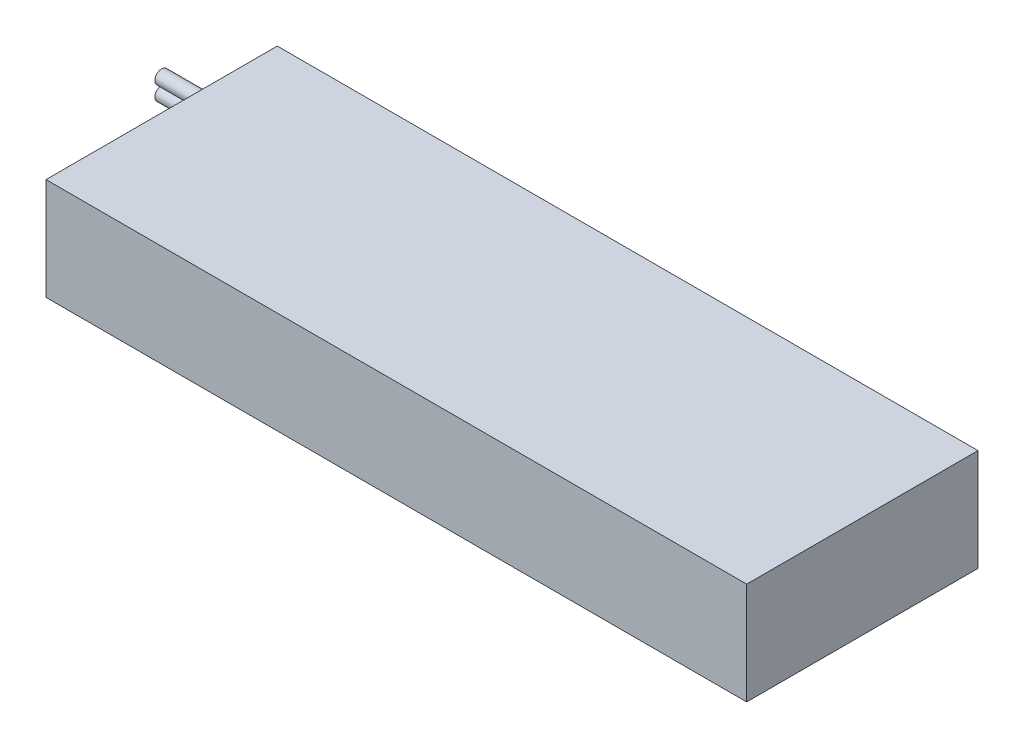
ISO-10303-21;
HEADER;
FILE_DESCRIPTION(('STEP AP214'),'2;1');
FILE_NAME('part.step','',(''),(''),'','','');
FILE_SCHEMA(('AUTOMOTIVE_DESIGN { 1 0 10303 214 1 1 1 1 }'));
ENDSEC;
DATA;
#1=APPLICATION_CONTEXT('core data for automotive mechanical design processes');
#2=APPLICATION_PROTOCOL_DEFINITION('international standard','automotive_design',2000,#1);
#3=PRODUCT_CONTEXT('',#1,'mechanical');
#4=PRODUCT('Part','Part','',(#3));
#5=PRODUCT_RELATED_PRODUCT_CATEGORY('part','',(#4));
#6=PRODUCT_DEFINITION_FORMATION('','',#4);
#7=PRODUCT_DEFINITION_CONTEXT('part definition',#1,'design');
#8=PRODUCT_DEFINITION('design','',#6,#7);
#9=PRODUCT_DEFINITION_SHAPE('','',#8);
#10=(LENGTH_UNIT() NAMED_UNIT(*) SI_UNIT(.MILLI.,.METRE.));
#11=(NAMED_UNIT(*) PLANE_ANGLE_UNIT() SI_UNIT($,.RADIAN.));
#12=(NAMED_UNIT(*) SI_UNIT($,.STERADIAN.) SOLID_ANGLE_UNIT());
#13=UNCERTAINTY_MEASURE_WITH_UNIT(LENGTH_MEASURE(1.E-05),#10,'distance_accuracy_value','');
#14=(GEOMETRIC_REPRESENTATION_CONTEXT(3) GLOBAL_UNCERTAINTY_ASSIGNED_CONTEXT((#13)) GLOBAL_UNIT_ASSIGNED_CONTEXT((#10,
#11,#12)) REPRESENTATION_CONTEXT('',''));
#15=CARTESIAN_POINT('',(0.,0.,0.));
#16=DIRECTION('',(0.,0.,1.));
#17=DIRECTION('',(1.,0.,0.));
#18=AXIS2_PLACEMENT_3D('',#15,#16,#17);
#19=CARTESIAN_POINT('',(0.,0.,34.));
#20=DIRECTION('',(1.,0.,0.));
#21=DIRECTION('',(0.,0.,-1.));
#22=AXIS2_PLACEMENT_3D('',#19,#20,#21);
#23=PLANE('',#22);
#24=CARTESIAN_POINT('',(0.,4.6,2.));
#25=DIRECTION('',(1.,0.,0.));
#26=DIRECTION('',(0.,0.,-1.));
#27=AXIS2_PLACEMENT_3D('',#24,#25,#26);
#28=CIRCLE('',#27,1.);
#29=CARTESIAN_POINT('',(0.,4.6,1.));
#30=VERTEX_POINT('',#29);
#31=EDGE_CURVE('E11',#30,#30,#28,.F.);
#32=ORIENTED_EDGE('',*,*,#31,.F.);
#33=EDGE_LOOP('',(#32));
#34=FACE_BOUND('',#33,.T.);
#35=CARTESIAN_POINT('',(0.,2.5,2.));
#36=DIRECTION('',(1.,0.,0.));
#37=DIRECTION('',(0.,0.,-1.));
#38=AXIS2_PLACEMENT_3D('',#35,#36,#37);
#39=CIRCLE('',#38,1.);
#40=CARTESIAN_POINT('',(0.,2.5,1.));
#41=VERTEX_POINT('',#40);
#42=EDGE_CURVE('E45',#41,#41,#39,.F.);
#43=ORIENTED_EDGE('',*,*,#42,.F.);
#44=EDGE_LOOP('',(#43));
#45=FACE_BOUND('',#44,.T.);
#46=DIRECTION('',(0.,-1.,0.));
#47=VECTOR('',#46,1.);
#48=CARTESIAN_POINT('',(0.,0.,0.));
#49=LINE('',#48,#47);
#50=CARTESIAN_POINT('',(0.,15.,0.));
#51=VERTEX_POINT('',#50);
#52=CARTESIAN_POINT('',(0.,0.,0.));
#53=VERTEX_POINT('',#52);
#54=EDGE_CURVE('E104',#51,#53,#49,.T.);
#55=ORIENTED_EDGE('',*,*,#54,.T.);
#56=DIRECTION('',(0.,0.,-1.));
#57=VECTOR('',#56,1.);
#58=CARTESIAN_POINT('',(0.,0.,34.));
#59=LINE('',#58,#57);
#60=CARTESIAN_POINT('',(0.,0.,34.));
#61=VERTEX_POINT('',#60);
#62=EDGE_CURVE('E95',#61,#53,#59,.T.);
#63=ORIENTED_EDGE('',*,*,#62,.F.);
#64=DIRECTION('',(0.,-1.,0.));
#65=VECTOR('',#64,1.);
#66=CARTESIAN_POINT('',(0.,0.,34.));
#67=LINE('',#66,#65);
#68=CARTESIAN_POINT('',(0.,15.,34.));
#69=VERTEX_POINT('',#68);
#70=EDGE_CURVE('E89',#69,#61,#67,.T.);
#71=ORIENTED_EDGE('',*,*,#70,.F.);
#72=DIRECTION('',(0.,0.,-1.));
#73=VECTOR('',#72,1.);
#74=CARTESIAN_POINT('',(0.,15.,34.));
#75=LINE('',#74,#73);
#76=EDGE_CURVE('E100',#69,#51,#75,.T.);
#77=ORIENTED_EDGE('',*,*,#76,.T.);
#78=EDGE_LOOP('',(#55,#63,#71,#77));
#79=FACE_BOUND('',#78,.T.);
#80=ADVANCED_FACE('F37',(#34,#45,#79),#23,.F.);
#81=CARTESIAN_POINT('',(0.,0.,34.));
#82=DIRECTION('',(0.,1.,0.));
#83=DIRECTION('',(0.,0.,1.));
#84=AXIS2_PLACEMENT_3D('',#81,#82,#83);
#85=PLANE('',#84);
#86=DIRECTION('',(1.,0.,0.));
#87=VECTOR('',#86,1.);
#88=CARTESIAN_POINT('',(0.,0.,0.));
#89=LINE('',#88,#87);
#90=CARTESIAN_POINT('',(103.,0.,0.));
#91=VERTEX_POINT('',#90);
#92=EDGE_CURVE('E94',#53,#91,#89,.T.);
#93=ORIENTED_EDGE('',*,*,#92,.T.);
#94=DIRECTION('',(0.,0.,-1.));
#95=VECTOR('',#94,1.);
#96=CARTESIAN_POINT('',(103.,0.,34.));
#97=LINE('',#96,#95);
#98=CARTESIAN_POINT('',(103.,0.,34.));
#99=VERTEX_POINT('',#98);
#100=EDGE_CURVE('E92',#99,#91,#97,.T.);
#101=ORIENTED_EDGE('',*,*,#100,.F.);
#102=DIRECTION('',(1.,0.,0.));
#103=VECTOR('',#102,1.);
#104=CARTESIAN_POINT('',(0.,0.,34.));
#105=LINE('',#104,#103);
#106=EDGE_CURVE('E84',#61,#99,#105,.T.);
#107=ORIENTED_EDGE('',*,*,#106,.F.);
#108=ORIENTED_EDGE('',*,*,#62,.T.);
#109=EDGE_LOOP('',(#93,#101,#107,#108));
#110=FACE_BOUND('',#109,.T.);
#111=ADVANCED_FACE('F93',(#110),#85,.F.);
#112=CARTESIAN_POINT('',(103.,0.,34.));
#113=DIRECTION('',(-1.,0.,0.));
#114=DIRECTION('',(0.,0.,1.));
#115=AXIS2_PLACEMENT_3D('',#112,#113,#114);
#116=PLANE('',#115);
#117=DIRECTION('',(0.,1.,0.));
#118=VECTOR('',#117,1.);
#119=CARTESIAN_POINT('',(103.,0.,0.));
#120=LINE('',#119,#118);
#121=CARTESIAN_POINT('',(103.,15.,0.));
#122=VERTEX_POINT('',#121);
#123=EDGE_CURVE('E70',#91,#122,#120,.T.);
#124=ORIENTED_EDGE('',*,*,#123,.T.);
#125=DIRECTION('',(0.,0.,-1.));
#126=VECTOR('',#125,1.);
#127=CARTESIAN_POINT('',(103.,15.,34.));
#128=LINE('',#127,#126);
#129=CARTESIAN_POINT('',(103.,15.,34.));
#130=VERTEX_POINT('',#129);
#131=EDGE_CURVE('E96',#130,#122,#128,.T.);
#132=ORIENTED_EDGE('',*,*,#131,.F.);
#133=DIRECTION('',(0.,1.,0.));
#134=VECTOR('',#133,1.);
#135=CARTESIAN_POINT('',(103.,0.,34.));
#136=LINE('',#135,#134);
#137=EDGE_CURVE('E87',#99,#130,#136,.T.);
#138=ORIENTED_EDGE('',*,*,#137,.F.);
#139=ORIENTED_EDGE('',*,*,#100,.T.);
#140=EDGE_LOOP('',(#124,#132,#138,#139));
#141=FACE_BOUND('',#140,.T.);
#142=ADVANCED_FACE('F98',(#141),#116,.F.);
#143=CARTESIAN_POINT('',(0.,15.,34.));
#144=DIRECTION('',(0.,-1.,0.));
#145=DIRECTION('',(0.,0.,-1.));
#146=AXIS2_PLACEMENT_3D('',#143,#144,#145);
#147=PLANE('',#146);
#148=DIRECTION('',(-1.,0.,0.));
#149=VECTOR('',#148,1.);
#150=CARTESIAN_POINT('',(0.,15.,0.));
#151=LINE('',#150,#149);
#152=EDGE_CURVE('E76',#122,#51,#151,.T.);
#153=ORIENTED_EDGE('',*,*,#152,.T.);
#154=ORIENTED_EDGE('',*,*,#76,.F.);
#155=DIRECTION('',(-1.,0.,0.));
#156=VECTOR('',#155,1.);
#157=CARTESIAN_POINT('',(0.,15.,34.));
#158=LINE('',#157,#156);
#159=EDGE_CURVE('E53',#130,#69,#158,.T.);
#160=ORIENTED_EDGE('',*,*,#159,.F.);
#161=ORIENTED_EDGE('',*,*,#131,.T.);
#162=EDGE_LOOP('',(#153,#154,#160,#161));
#163=FACE_BOUND('',#162,.T.);
#164=ADVANCED_FACE('F133',(#163),#147,.F.);
#165=CARTESIAN_POINT('',(0.,0.,34.));
#166=DIRECTION('',(0.,0.,-1.));
#167=DIRECTION('',(-1.,0.,0.));
#168=AXIS2_PLACEMENT_3D('',#165,#166,#167);
#169=PLANE('',#168);
#170=ORIENTED_EDGE('',*,*,#70,.T.);
#171=ORIENTED_EDGE('',*,*,#106,.T.);
#172=ORIENTED_EDGE('',*,*,#137,.T.);
#173=ORIENTED_EDGE('',*,*,#159,.T.);
#174=EDGE_LOOP('',(#170,#171,#172,#173));
#175=FACE_BOUND('',#174,.T.);
#176=ADVANCED_FACE('F85',(#175),#169,.F.);
#177=CARTESIAN_POINT('',(0.,0.,0.));
#178=DIRECTION('',(0.,0.,-1.));
#179=DIRECTION('',(-1.,0.,0.));
#180=AXIS2_PLACEMENT_3D('',#177,#178,#179);
#181=PLANE('',#180);
#182=ORIENTED_EDGE('',*,*,#54,.F.);
#183=ORIENTED_EDGE('',*,*,#152,.F.);
#184=ORIENTED_EDGE('',*,*,#123,.F.);
#185=ORIENTED_EDGE('',*,*,#92,.F.);
#186=EDGE_LOOP('',(#182,#183,#184,#185));
#187=FACE_BOUND('',#186,.T.);
#188=ADVANCED_FACE('F123',(#187),#181,.T.);
#189=CARTESIAN_POINT('',(-15.,2.5,2.));
#190=DIRECTION('',(1.,0.,0.));
#191=DIRECTION('',(0.,0.,-1.));
#192=AXIS2_PLACEMENT_3D('',#189,#190,#191);
#193=CYLINDRICAL_SURFACE('',#192,1.);
#194=CARTESIAN_POINT('',(-15.,2.5,2.));
#195=DIRECTION('',(-1.,0.,0.));
#196=DIRECTION('',(0.,0.,1.));
#197=AXIS2_PLACEMENT_3D('',#194,#195,#196);
#198=CIRCLE('',#197,1.);
#199=CARTESIAN_POINT('',(-15.,2.5,3.));
#200=VERTEX_POINT('',#199);
#201=EDGE_CURVE('E107',#200,#200,#198,.T.);
#202=ORIENTED_EDGE('',*,*,#201,.F.);
#203=EDGE_LOOP('',(#202));
#204=FACE_BOUND('',#203,.T.);
#205=ORIENTED_EDGE('',*,*,#42,.T.);
#206=EDGE_LOOP('',(#205));
#207=FACE_BOUND('',#206,.T.);
#208=ADVANCED_FACE('F116',(#204,#207),#193,.T.);
#209=CARTESIAN_POINT('',(-15.,2.5,2.));
#210=DIRECTION('',(-1.,0.,0.));
#211=DIRECTION('',(0.,0.,1.));
#212=AXIS2_PLACEMENT_3D('',#209,#210,#211);
#213=PLANE('',#212);
#214=ORIENTED_EDGE('',*,*,#201,.T.);
#215=EDGE_LOOP('',(#214));
#216=FACE_BOUND('',#215,.T.);
#217=ADVANCED_FACE('F130',(#216),#213,.T.);
#218=CARTESIAN_POINT('',(-15.,4.6,2.));
#219=DIRECTION('',(1.,0.,0.));
#220=DIRECTION('',(0.,0.,-1.));
#221=AXIS2_PLACEMENT_3D('',#218,#219,#220);
#222=CYLINDRICAL_SURFACE('',#221,1.);
#223=CARTESIAN_POINT('',(-15.,4.6,2.));
#224=DIRECTION('',(-1.,0.,0.));
#225=DIRECTION('',(0.,0.,1.));
#226=AXIS2_PLACEMENT_3D('',#223,#224,#225);
#227=CIRCLE('',#226,1.);
#228=CARTESIAN_POINT('',(-15.,4.6,3.));
#229=VERTEX_POINT('',#228);
#230=EDGE_CURVE('E205',#229,#229,#227,.T.);
#231=ORIENTED_EDGE('',*,*,#230,.F.);
#232=EDGE_LOOP('',(#231));
#233=FACE_BOUND('',#232,.T.);
#234=ORIENTED_EDGE('',*,*,#31,.T.);
#235=EDGE_LOOP('',(#234));
#236=FACE_BOUND('',#235,.T.);
#237=ADVANCED_FACE('F179',(#233,#236),#222,.T.);
#238=CARTESIAN_POINT('',(-15.,4.6,2.));
#239=DIRECTION('',(-1.,0.,0.));
#240=DIRECTION('',(0.,0.,1.));
#241=AXIS2_PLACEMENT_3D('',#238,#239,#240);
#242=PLANE('',#241);
#243=ORIENTED_EDGE('',*,*,#230,.T.);
#244=EDGE_LOOP('',(#243));
#245=FACE_BOUND('',#244,.T.);
#246=ADVANCED_FACE('F189',(#245),#242,.T.);
#247=CLOSED_SHELL('',(#80,#111,#142,#164,#176,#188,#208,#217,#237,#246));
#248=MANIFOLD_SOLID_BREP('B2',#247);
#249=ADVANCED_BREP_SHAPE_REPRESENTATION('',(#18,#248),#14);
#250=SHAPE_DEFINITION_REPRESENTATION(#9,#249);
ENDSEC;
END-ISO-10303-21;
